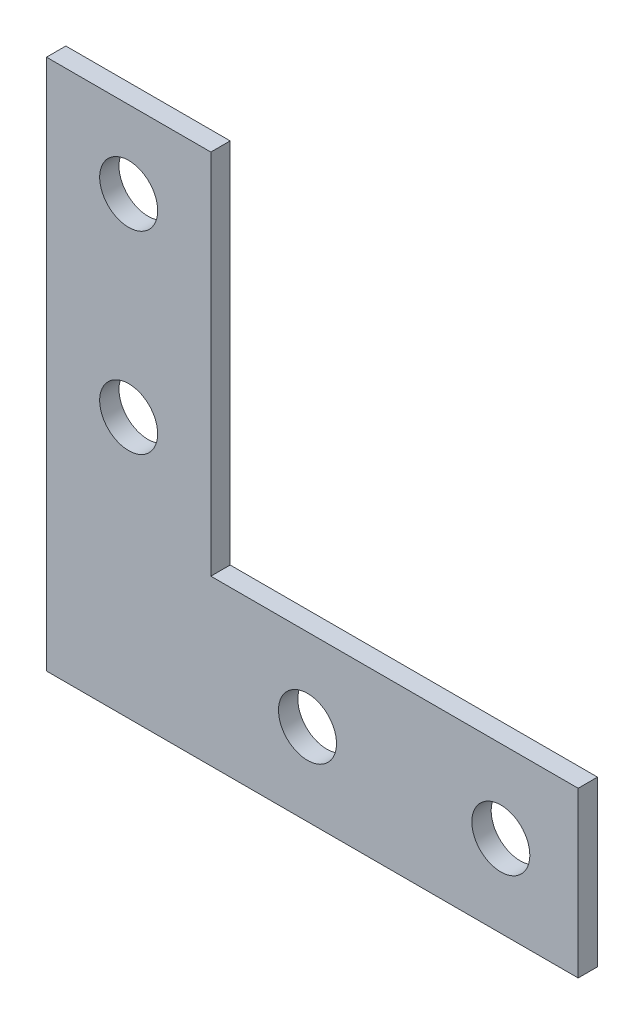
ISO-10303-21;
HEADER;
FILE_DESCRIPTION(('STEP AP214'),'2;1');
FILE_NAME('part.step','',(''),(''),'','','');
FILE_SCHEMA(('AUTOMOTIVE_DESIGN { 1 0 10303 214 1 1 1 1 }'));
ENDSEC;
DATA;
#1=APPLICATION_CONTEXT('core data for automotive mechanical design processes');
#2=APPLICATION_PROTOCOL_DEFINITION('international standard','automotive_design',2000,#1);
#3=PRODUCT_CONTEXT('',#1,'mechanical');
#4=PRODUCT('Part','Part','',(#3));
#5=PRODUCT_RELATED_PRODUCT_CATEGORY('part','',(#4));
#6=PRODUCT_DEFINITION_FORMATION('','',#4);
#7=PRODUCT_DEFINITION_CONTEXT('part definition',#1,'design');
#8=PRODUCT_DEFINITION('design','',#6,#7);
#9=PRODUCT_DEFINITION_SHAPE('','',#8);
#10=(LENGTH_UNIT() NAMED_UNIT(*) SI_UNIT(.MILLI.,.METRE.));
#11=(NAMED_UNIT(*) PLANE_ANGLE_UNIT() SI_UNIT($,.RADIAN.));
#12=(NAMED_UNIT(*) SI_UNIT($,.STERADIAN.) SOLID_ANGLE_UNIT());
#13=UNCERTAINTY_MEASURE_WITH_UNIT(LENGTH_MEASURE(1.E-05),#10,'distance_accuracy_value','');
#14=(GEOMETRIC_REPRESENTATION_CONTEXT(3) GLOBAL_UNCERTAINTY_ASSIGNED_CONTEXT((#13)) GLOBAL_UNIT_ASSIGNED_CONTEXT((#10,
#11,#12)) REPRESENTATION_CONTEXT('',''));
#15=CARTESIAN_POINT('',(0.,0.,0.));
#16=DIRECTION('',(0.,0.,1.));
#17=DIRECTION('',(1.,0.,0.));
#18=AXIS2_PLACEMENT_3D('',#15,#16,#17);
#19=CARTESIAN_POINT('',(8.5,27.5,2.));
#20=DIRECTION('',(0.,0.,-1.));
#21=DIRECTION('',(-1.,0.,0.));
#22=AXIS2_PLACEMENT_3D('',#19,#20,#21);
#23=PLANE('',#22);
#24=CARTESIAN_POINT('',(38.5,-18.9999999999999,2.));
#25=DIRECTION('',(0.,0.,-1.));
#26=DIRECTION('',(0.,1.,0.));
#27=AXIS2_PLACEMENT_3D('',#24,#25,#26);
#28=CIRCLE('',#27,3.);
#29=CARTESIAN_POINT('',(38.5,-15.9999999999999,2.));
#30=VERTEX_POINT('',#29);
#31=EDGE_CURVE('E149',#30,#30,#28,.T.);
#32=ORIENTED_EDGE('',*,*,#31,.T.);
#33=EDGE_LOOP('',(#32));
#34=FACE_BOUND('',#33,.T.);
#35=CARTESIAN_POINT('',(0.,-0.5,2.));
#36=DIRECTION('',(0.,0.,1.));
#37=DIRECTION('',(1.,0.,0.));
#38=AXIS2_PLACEMENT_3D('',#35,#36,#37);
#39=CIRCLE('',#38,3.);
#40=CARTESIAN_POINT('',(3.,-0.5,2.));
#41=VERTEX_POINT('',#40);
#42=EDGE_CURVE('E146',#41,#41,#39,.T.);
#43=ORIENTED_EDGE('',*,*,#42,.F.);
#44=EDGE_LOOP('',(#43));
#45=FACE_BOUND('',#44,.T.);
#46=CARTESIAN_POINT('',(0.,19.5,2.));
#47=DIRECTION('',(0.,0.,1.));
#48=DIRECTION('',(1.,0.,0.));
#49=AXIS2_PLACEMENT_3D('',#46,#47,#48);
#50=CIRCLE('',#49,3.);
#51=CARTESIAN_POINT('',(3.,19.5,2.));
#52=VERTEX_POINT('',#51);
#53=EDGE_CURVE('E143',#52,#52,#50,.T.);
#54=ORIENTED_EDGE('',*,*,#53,.F.);
#55=EDGE_LOOP('',(#54));
#56=FACE_BOUND('',#55,.T.);
#57=DIRECTION('',(0.,-1.,0.));
#58=VECTOR('',#57,1.);
#59=CARTESIAN_POINT('',(-8.5,-27.5,2.));
#60=LINE('',#59,#58);
#61=CARTESIAN_POINT('',(-8.5,27.5,2.));
#62=VERTEX_POINT('',#61);
#63=CARTESIAN_POINT('',(-8.5,-27.5,2.));
#64=VERTEX_POINT('',#63);
#65=EDGE_CURVE('E59',#62,#64,#60,.T.);
#66=ORIENTED_EDGE('',*,*,#65,.T.);
#67=DIRECTION('',(1.,0.,0.));
#68=VECTOR('',#67,1.);
#69=CARTESIAN_POINT('',(-8.5,-27.5,2.));
#70=LINE('',#69,#68);
#71=CARTESIAN_POINT('',(46.5,-27.4999999999998,2.));
#72=VERTEX_POINT('',#71);
#73=EDGE_CURVE('E95',#64,#72,#70,.T.);
#74=ORIENTED_EDGE('',*,*,#73,.T.);
#75=DIRECTION('',(0.,-1.,0.));
#76=VECTOR('',#75,1.);
#77=CARTESIAN_POINT('',(46.5,-27.4999999999998,2.));
#78=LINE('',#77,#76);
#79=CARTESIAN_POINT('',(46.4999999999999,-10.4999999999998,2.));
#80=VERTEX_POINT('',#79);
#81=EDGE_CURVE('E99',#80,#72,#78,.T.);
#82=ORIENTED_EDGE('',*,*,#81,.F.);
#83=DIRECTION('',(1.,0.,0.));
#84=VECTOR('',#83,1.);
#85=CARTESIAN_POINT('',(-8.50000000000006,-10.5,2.));
#86=LINE('',#85,#84);
#87=CARTESIAN_POINT('',(8.5,-10.5,2.));
#88=VERTEX_POINT('',#87);
#89=EDGE_CURVE('E117',#88,#80,#86,.T.);
#90=ORIENTED_EDGE('',*,*,#89,.F.);
#91=DIRECTION('',(0.,1.,0.));
#92=VECTOR('',#91,1.);
#93=CARTESIAN_POINT('',(8.5,-27.5,2.));
#94=LINE('',#93,#92);
#95=CARTESIAN_POINT('',(8.5,27.5,2.));
#96=VERTEX_POINT('',#95);
#97=EDGE_CURVE('E50',#88,#96,#94,.T.);
#98=ORIENTED_EDGE('',*,*,#97,.T.);
#99=DIRECTION('',(-1.,0.,0.));
#100=VECTOR('',#99,1.);
#101=CARTESIAN_POINT('',(-8.5,27.5,2.));
#102=LINE('',#101,#100);
#103=EDGE_CURVE('E131',#96,#62,#102,.T.);
#104=ORIENTED_EDGE('',*,*,#103,.T.);
#105=EDGE_LOOP('',(#66,#74,#82,#90,#98,#104));
#106=FACE_BOUND('',#105,.T.);
#107=CARTESIAN_POINT('',(18.5,-19.,2.));
#108=DIRECTION('',(0.,0.,-1.));
#109=DIRECTION('',(0.,1.,0.));
#110=AXIS2_PLACEMENT_3D('',#107,#108,#109);
#111=CIRCLE('',#110,3.);
#112=CARTESIAN_POINT('',(18.5,-16.,2.));
#113=VERTEX_POINT('',#112);
#114=EDGE_CURVE('E159',#113,#113,#111,.T.);
#115=ORIENTED_EDGE('',*,*,#114,.T.);
#116=EDGE_LOOP('',(#115));
#117=FACE_BOUND('',#116,.T.);
#118=ADVANCED_FACE('F33',(#34,#45,#56,#106,#117),#23,.F.);
#119=CARTESIAN_POINT('',(8.5,27.5,0.));
#120=DIRECTION('',(0.,0.,-1.));
#121=DIRECTION('',(-1.,0.,0.));
#122=AXIS2_PLACEMENT_3D('',#119,#120,#121);
#123=PLANE('',#122);
#124=CARTESIAN_POINT('',(38.5,-18.9999999999999,0.));
#125=DIRECTION('',(0.,0.,-1.));
#126=DIRECTION('',(-1.,0.,0.));
#127=AXIS2_PLACEMENT_3D('',#124,#125,#126);
#128=CIRCLE('',#127,3.);
#129=CARTESIAN_POINT('',(35.5,-18.9999999999999,0.));
#130=VERTEX_POINT('',#129);
#131=EDGE_CURVE('E147',#130,#130,#128,.F.);
#132=ORIENTED_EDGE('',*,*,#131,.T.);
#133=EDGE_LOOP('',(#132));
#134=FACE_BOUND('',#133,.T.);
#135=CARTESIAN_POINT('',(0.,-0.5,0.));
#136=DIRECTION('',(0.,0.,-1.));
#137=DIRECTION('',(-1.,0.,0.));
#138=AXIS2_PLACEMENT_3D('',#135,#136,#137);
#139=CIRCLE('',#138,3.);
#140=CARTESIAN_POINT('',(-3.,-0.5,0.));
#141=VERTEX_POINT('',#140);
#142=EDGE_CURVE('E144',#141,#141,#139,.T.);
#143=ORIENTED_EDGE('',*,*,#142,.F.);
#144=EDGE_LOOP('',(#143));
#145=FACE_BOUND('',#144,.T.);
#146=CARTESIAN_POINT('',(0.,19.5,0.));
#147=DIRECTION('',(0.,0.,-1.));
#148=DIRECTION('',(-1.,0.,0.));
#149=AXIS2_PLACEMENT_3D('',#146,#147,#148);
#150=CIRCLE('',#149,3.);
#151=CARTESIAN_POINT('',(-3.,19.5,0.));
#152=VERTEX_POINT('',#151);
#153=EDGE_CURVE('E126',#152,#152,#150,.T.);
#154=ORIENTED_EDGE('',*,*,#153,.F.);
#155=EDGE_LOOP('',(#154));
#156=FACE_BOUND('',#155,.T.);
#157=DIRECTION('',(0.,1.,0.));
#158=VECTOR('',#157,1.);
#159=CARTESIAN_POINT('',(8.5,-27.5,0.));
#160=LINE('',#159,#158);
#161=CARTESIAN_POINT('',(8.5,-10.4999999999999,0.));
#162=VERTEX_POINT('',#161);
#163=CARTESIAN_POINT('',(8.5,27.5,0.));
#164=VERTEX_POINT('',#163);
#165=EDGE_CURVE('E129',#162,#164,#160,.T.);
#166=ORIENTED_EDGE('',*,*,#165,.F.);
#167=DIRECTION('',(1.,0.,0.));
#168=VECTOR('',#167,1.);
#169=CARTESIAN_POINT('',(-8.50000000000006,-10.5,0.));
#170=LINE('',#169,#168);
#171=CARTESIAN_POINT('',(46.4999999999999,-10.4999999999998,0.));
#172=VERTEX_POINT('',#171);
#173=EDGE_CURVE('E124',#162,#172,#170,.T.);
#174=ORIENTED_EDGE('',*,*,#173,.T.);
#175=DIRECTION('',(0.,-1.,0.));
#176=VECTOR('',#175,1.);
#177=CARTESIAN_POINT('',(46.5,-27.4999999999998,0.));
#178=LINE('',#177,#176);
#179=CARTESIAN_POINT('',(46.5,-27.4999999999998,0.));
#180=VERTEX_POINT('',#179);
#181=EDGE_CURVE('E120',#172,#180,#178,.T.);
#182=ORIENTED_EDGE('',*,*,#181,.T.);
#183=DIRECTION('',(1.,0.,0.));
#184=VECTOR('',#183,1.);
#185=CARTESIAN_POINT('',(-8.5,-27.5,0.));
#186=LINE('',#185,#184);
#187=CARTESIAN_POINT('',(-8.5,-27.5,0.));
#188=VERTEX_POINT('',#187);
#189=EDGE_CURVE('E107',#188,#180,#186,.T.);
#190=ORIENTED_EDGE('',*,*,#189,.F.);
#191=DIRECTION('',(0.,-1.,0.));
#192=VECTOR('',#191,1.);
#193=CARTESIAN_POINT('',(-8.5,-27.5,0.));
#194=LINE('',#193,#192);
#195=CARTESIAN_POINT('',(-8.5,27.5,0.));
#196=VERTEX_POINT('',#195);
#197=EDGE_CURVE('E76',#196,#188,#194,.T.);
#198=ORIENTED_EDGE('',*,*,#197,.F.);
#199=DIRECTION('',(-1.,0.,0.));
#200=VECTOR('',#199,1.);
#201=CARTESIAN_POINT('',(-8.5,27.5,0.));
#202=LINE('',#201,#200);
#203=EDGE_CURVE('E135',#164,#196,#202,.T.);
#204=ORIENTED_EDGE('',*,*,#203,.F.);
#205=EDGE_LOOP('',(#166,#174,#182,#190,#198,#204));
#206=FACE_BOUND('',#205,.T.);
#207=CARTESIAN_POINT('',(18.5,-19.,0.));
#208=DIRECTION('',(0.,0.,-1.));
#209=DIRECTION('',(-1.,0.,0.));
#210=AXIS2_PLACEMENT_3D('',#207,#208,#209);
#211=CIRCLE('',#210,3.);
#212=CARTESIAN_POINT('',(15.5,-19.,0.));
#213=VERTEX_POINT('',#212);
#214=EDGE_CURVE('E37',#213,#213,#211,.F.);
#215=ORIENTED_EDGE('',*,*,#214,.T.);
#216=EDGE_LOOP('',(#215));
#217=FACE_BOUND('',#216,.T.);
#218=ADVANCED_FACE('F167',(#134,#145,#156,#206,#217),#123,.T.);
#219=CARTESIAN_POINT('',(8.5,-27.5,2.));
#220=DIRECTION('',(-1.,0.,0.));
#221=DIRECTION('',(0.,0.,1.));
#222=AXIS2_PLACEMENT_3D('',#219,#220,#221);
#223=PLANE('',#222);
#224=ORIENTED_EDGE('',*,*,#97,.F.);
#225=DIRECTION('',(0.,0.,-1.));
#226=VECTOR('',#225,1.);
#227=CARTESIAN_POINT('',(8.5,-10.4999999999999,2.));
#228=LINE('',#227,#226);
#229=EDGE_CURVE('E111',#88,#162,#228,.T.);
#230=ORIENTED_EDGE('',*,*,#229,.T.);
#231=ORIENTED_EDGE('',*,*,#165,.T.);
#232=DIRECTION('',(0.,0.,-1.));
#233=VECTOR('',#232,1.);
#234=CARTESIAN_POINT('',(8.5,27.5,2.));
#235=LINE('',#234,#233);
#236=EDGE_CURVE('E11',#96,#164,#235,.T.);
#237=ORIENTED_EDGE('',*,*,#236,.F.);
#238=EDGE_LOOP('',(#224,#230,#231,#237));
#239=FACE_BOUND('',#238,.T.);
#240=ADVANCED_FACE('F35',(#239),#223,.F.);
#241=CARTESIAN_POINT('',(-8.5,27.5,2.));
#242=DIRECTION('',(0.,-1.,0.));
#243=DIRECTION('',(0.,0.,-1.));
#244=AXIS2_PLACEMENT_3D('',#241,#242,#243);
#245=PLANE('',#244);
#246=ORIENTED_EDGE('',*,*,#203,.T.);
#247=DIRECTION('',(0.,0.,-1.));
#248=VECTOR('',#247,1.);
#249=CARTESIAN_POINT('',(-8.5,27.5,2.));
#250=LINE('',#249,#248);
#251=EDGE_CURVE('E42',#62,#196,#250,.T.);
#252=ORIENTED_EDGE('',*,*,#251,.F.);
#253=ORIENTED_EDGE('',*,*,#103,.F.);
#254=ORIENTED_EDGE('',*,*,#236,.T.);
#255=EDGE_LOOP('',(#246,#252,#253,#254));
#256=FACE_BOUND('',#255,.T.);
#257=ADVANCED_FACE('F182',(#256),#245,.F.);
#258=CARTESIAN_POINT('',(-8.5,-27.5,2.));
#259=DIRECTION('',(1.,0.,0.));
#260=DIRECTION('',(0.,0.,-1.));
#261=AXIS2_PLACEMENT_3D('',#258,#259,#260);
#262=PLANE('',#261);
#263=ORIENTED_EDGE('',*,*,#197,.T.);
#264=DIRECTION('',(0.,0.,-1.));
#265=VECTOR('',#264,1.);
#266=CARTESIAN_POINT('',(-8.5,-27.5,2.));
#267=LINE('',#266,#265);
#268=EDGE_CURVE('E101',#64,#188,#267,.T.);
#269=ORIENTED_EDGE('',*,*,#268,.F.);
#270=ORIENTED_EDGE('',*,*,#65,.F.);
#271=ORIENTED_EDGE('',*,*,#251,.T.);
#272=EDGE_LOOP('',(#263,#269,#270,#271));
#273=FACE_BOUND('',#272,.T.);
#274=ADVANCED_FACE('F180',(#273),#262,.F.);
#275=CARTESIAN_POINT('',(-8.5,-27.5,2.));
#276=DIRECTION('',(0.,1.,0.));
#277=DIRECTION('',(0.,0.,1.));
#278=AXIS2_PLACEMENT_3D('',#275,#276,#277);
#279=PLANE('',#278);
#280=ORIENTED_EDGE('',*,*,#189,.T.);
#281=DIRECTION('',(0.,0.,-1.));
#282=VECTOR('',#281,1.);
#283=CARTESIAN_POINT('',(46.5,-27.4999999999998,2.));
#284=LINE('',#283,#282);
#285=EDGE_CURVE('E104',#72,#180,#284,.T.);
#286=ORIENTED_EDGE('',*,*,#285,.F.);
#287=ORIENTED_EDGE('',*,*,#73,.F.);
#288=ORIENTED_EDGE('',*,*,#268,.T.);
#289=EDGE_LOOP('',(#280,#286,#287,#288));
#290=FACE_BOUND('',#289,.T.);
#291=ADVANCED_FACE('F105',(#290),#279,.F.);
#292=CARTESIAN_POINT('',(-8.50000000000006,-10.5,2.));
#293=DIRECTION('',(0.,1.,0.));
#294=DIRECTION('',(-1.,0.,0.));
#295=AXIS2_PLACEMENT_3D('',#292,#293,#294);
#296=PLANE('',#295);
#297=ORIENTED_EDGE('',*,*,#229,.F.);
#298=ORIENTED_EDGE('',*,*,#89,.T.);
#299=DIRECTION('',(0.,0.,-1.));
#300=VECTOR('',#299,1.);
#301=CARTESIAN_POINT('',(46.4999999999999,-10.4999999999998,2.));
#302=LINE('',#301,#300);
#303=EDGE_CURVE('E112',#80,#172,#302,.T.);
#304=ORIENTED_EDGE('',*,*,#303,.T.);
#305=ORIENTED_EDGE('',*,*,#173,.F.);
#306=EDGE_LOOP('',(#297,#298,#304,#305));
#307=FACE_BOUND('',#306,.T.);
#308=ADVANCED_FACE('F175',(#307),#296,.T.);
#309=CARTESIAN_POINT('',(46.5,-27.4999999999998,2.));
#310=DIRECTION('',(1.,0.,0.));
#311=DIRECTION('',(0.,1.,0.));
#312=AXIS2_PLACEMENT_3D('',#309,#310,#311);
#313=PLANE('',#312);
#314=ORIENTED_EDGE('',*,*,#181,.F.);
#315=ORIENTED_EDGE('',*,*,#303,.F.);
#316=ORIENTED_EDGE('',*,*,#81,.T.);
#317=ORIENTED_EDGE('',*,*,#285,.T.);
#318=EDGE_LOOP('',(#314,#315,#316,#317));
#319=FACE_BOUND('',#318,.T.);
#320=ADVANCED_FACE('F115',(#319),#313,.T.);
#321=CARTESIAN_POINT('',(0.,19.5,-8.));
#322=DIRECTION('',(0.,0.,1.));
#323=DIRECTION('',(1.,0.,0.));
#324=AXIS2_PLACEMENT_3D('',#321,#322,#323);
#325=CYLINDRICAL_SURFACE('',#324,3.);
#326=ORIENTED_EDGE('',*,*,#153,.T.);
#327=EDGE_LOOP('',(#326));
#328=FACE_BOUND('',#327,.T.);
#329=ORIENTED_EDGE('',*,*,#53,.T.);
#330=EDGE_LOOP('',(#329));
#331=FACE_BOUND('',#330,.T.);
#332=ADVANCED_FACE('F164',(#328,#331),#325,.F.);
#333=CARTESIAN_POINT('',(0.,-0.5,-8.));
#334=DIRECTION('',(0.,0.,1.));
#335=DIRECTION('',(1.,0.,0.));
#336=AXIS2_PLACEMENT_3D('',#333,#334,#335);
#337=CYLINDRICAL_SURFACE('',#336,3.);
#338=ORIENTED_EDGE('',*,*,#142,.T.);
#339=EDGE_LOOP('',(#338));
#340=FACE_BOUND('',#339,.T.);
#341=ORIENTED_EDGE('',*,*,#42,.T.);
#342=EDGE_LOOP('',(#341));
#343=FACE_BOUND('',#342,.T.);
#344=ADVANCED_FACE('F201',(#340,#343),#337,.F.);
#345=CARTESIAN_POINT('',(38.5,-18.9999999999999,-8.));
#346=DIRECTION('',(0.,0.,1.));
#347=DIRECTION('',(1.,0.,0.));
#348=AXIS2_PLACEMENT_3D('',#345,#346,#347);
#349=CYLINDRICAL_SURFACE('',#348,3.);
#350=ORIENTED_EDGE('',*,*,#131,.F.);
#351=EDGE_LOOP('',(#350));
#352=FACE_BOUND('',#351,.T.);
#353=ORIENTED_EDGE('',*,*,#31,.F.);
#354=EDGE_LOOP('',(#353));
#355=FACE_BOUND('',#354,.T.);
#356=ADVANCED_FACE('F207',(#352,#355),#349,.F.);
#357=CARTESIAN_POINT('',(18.5,-19.,-8.));
#358=DIRECTION('',(0.,0.,1.));
#359=DIRECTION('',(1.,0.,0.));
#360=AXIS2_PLACEMENT_3D('',#357,#358,#359);
#361=CYLINDRICAL_SURFACE('',#360,3.);
#362=ORIENTED_EDGE('',*,*,#214,.F.);
#363=EDGE_LOOP('',(#362));
#364=FACE_BOUND('',#363,.T.);
#365=ORIENTED_EDGE('',*,*,#114,.F.);
#366=EDGE_LOOP('',(#365));
#367=FACE_BOUND('',#366,.T.);
#368=ADVANCED_FACE('F211',(#364,#367),#361,.F.);
#369=CLOSED_SHELL('',(#118,#218,#240,#257,#274,#291,#308,#320,#332,#344,#356,#368));
#370=MANIFOLD_SOLID_BREP('B2',#369);
#371=ADVANCED_BREP_SHAPE_REPRESENTATION('',(#18,#370),#14);
#372=SHAPE_DEFINITION_REPRESENTATION(#9,#371);
ENDSEC;
END-ISO-10303-21;
